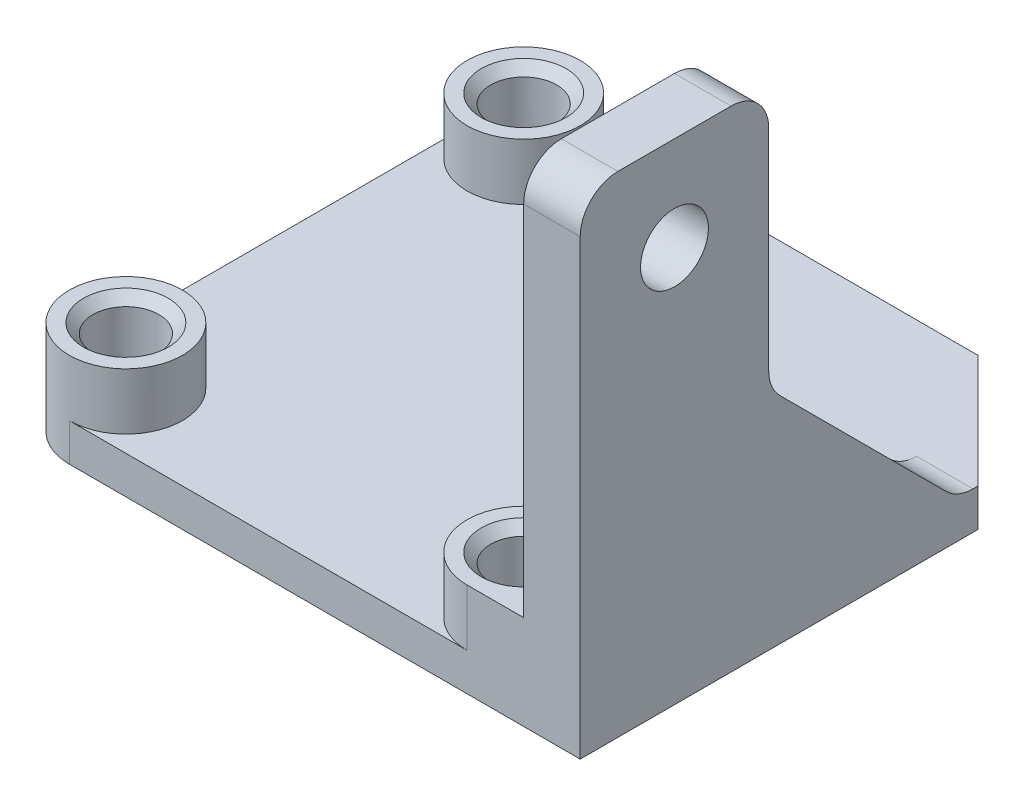
ISO-10303-21;
HEADER;
FILE_DESCRIPTION(('STEP AP214'),'2;1');
FILE_NAME('part.step','',(''),(''),'','','');
FILE_SCHEMA(('AUTOMOTIVE_DESIGN { 1 0 10303 214 1 1 1 1 }'));
ENDSEC;
DATA;
#1=APPLICATION_CONTEXT('core data for automotive mechanical design processes');
#2=APPLICATION_PROTOCOL_DEFINITION('international standard','automotive_design',2000,#1);
#3=PRODUCT_CONTEXT('',#1,'mechanical');
#4=PRODUCT('Part','Part','',(#3));
#5=PRODUCT_RELATED_PRODUCT_CATEGORY('part','',(#4));
#6=PRODUCT_DEFINITION_FORMATION('','',#4);
#7=PRODUCT_DEFINITION_CONTEXT('part definition',#1,'design');
#8=PRODUCT_DEFINITION('design','',#6,#7);
#9=PRODUCT_DEFINITION_SHAPE('','',#8);
#10=(LENGTH_UNIT() NAMED_UNIT(*) SI_UNIT(.MILLI.,.METRE.));
#11=(NAMED_UNIT(*) PLANE_ANGLE_UNIT() SI_UNIT($,.RADIAN.));
#12=(NAMED_UNIT(*) SI_UNIT($,.STERADIAN.) SOLID_ANGLE_UNIT());
#13=UNCERTAINTY_MEASURE_WITH_UNIT(LENGTH_MEASURE(1.E-05),#10,'distance_accuracy_value','');
#14=(GEOMETRIC_REPRESENTATION_CONTEXT(3) GLOBAL_UNCERTAINTY_ASSIGNED_CONTEXT((#13)) GLOBAL_UNIT_ASSIGNED_CONTEXT((#10,
#11,#12)) REPRESENTATION_CONTEXT('',''));
#15=CARTESIAN_POINT('',(0.,0.,0.));
#16=DIRECTION('',(0.,0.,1.));
#17=DIRECTION('',(1.,0.,0.));
#18=AXIS2_PLACEMENT_3D('',#15,#16,#17);
#19=CARTESIAN_POINT('',(0.,0.,0.));
#20=DIRECTION('',(0.,-1.,0.));
#21=DIRECTION('',(0.,0.,-1.));
#22=AXIS2_PLACEMENT_3D('',#19,#20,#21);
#23=PLANE('',#22);
#24=DIRECTION('',(0.,0.,1.));
#25=VECTOR('',#24,1.);
#26=CARTESIAN_POINT('',(6.,0.,-24.1));
#27=LINE('',#26,#25);
#28=CARTESIAN_POINT('',(6.,0.,-18.1));
#29=VERTEX_POINT('',#28);
#30=CARTESIAN_POINT('',(6.,0.,-17.8284271247462));
#31=VERTEX_POINT('',#30);
#32=EDGE_CURVE('E334',#29,#31,#27,.T.);
#33=ORIENTED_EDGE('',*,*,#32,.F.);
#34=DIRECTION('',(0.707106781186546,0.,0.707106781186549));
#35=VECTOR('',#34,1.);
#36=CARTESIAN_POINT('',(0.,0.,-24.1));
#37=LINE('',#36,#35);
#38=CARTESIAN_POINT('',(0.,0.,-24.1));
#39=VERTEX_POINT('',#38);
#40=EDGE_CURVE('E11',#29,#39,#37,.F.);
#41=ORIENTED_EDGE('',*,*,#40,.T.);
#42=DIRECTION('',(1.,0.,0.));
#43=VECTOR('',#42,1.);
#44=CARTESIAN_POINT('',(0.,0.,-24.1));
#45=LINE('',#44,#43);
#46=CARTESIAN_POINT('',(-21.1,0.,-24.1));
#47=VERTEX_POINT('',#46);
#48=EDGE_CURVE('E213',#47,#39,#45,.T.);
#49=ORIENTED_EDGE('',*,*,#48,.F.);
#50=CARTESIAN_POINT('',(-21.1,0.,-21.1));
#51=DIRECTION('',(0.,1.,0.));
#52=DIRECTION('',(0.,0.,1.));
#53=AXIS2_PLACEMENT_3D('',#50,#51,#52);
#54=CIRCLE('',#53,3.);
#55=CARTESIAN_POINT('',(-24.1,0.,-21.1));
#56=VERTEX_POINT('',#55);
#57=EDGE_CURVE('E197',#56,#47,#54,.T.);
#58=ORIENTED_EDGE('',*,*,#57,.F.);
#59=DIRECTION('',(0.,0.,1.));
#60=VECTOR('',#59,1.);
#61=CARTESIAN_POINT('',(-24.1,0.,0.));
#62=LINE('',#61,#60);
#63=CARTESIAN_POINT('',(-24.1,0.,0.));
#64=VERTEX_POINT('',#63);
#65=EDGE_CURVE('E236',#56,#64,#62,.T.);
#66=ORIENTED_EDGE('',*,*,#65,.T.);
#67=CARTESIAN_POINT('',(-21.1,0.,0.));
#68=DIRECTION('',(0.,1.,0.));
#69=DIRECTION('',(0.,0.,1.));
#70=AXIS2_PLACEMENT_3D('',#67,#68,#69);
#71=CIRCLE('',#70,3.);
#72=CARTESIAN_POINT('',(-21.1,0.,3.));
#73=VERTEX_POINT('',#72);
#74=EDGE_CURVE('E201',#73,#64,#71,.T.);
#75=ORIENTED_EDGE('',*,*,#74,.F.);
#76=DIRECTION('',(1.,0.,0.));
#77=VECTOR('',#76,1.);
#78=CARTESIAN_POINT('',(0.,0.,3.));
#79=LINE('',#78,#77);
#80=CARTESIAN_POINT('',(0.,0.,3.));
#81=VERTEX_POINT('',#80);
#82=EDGE_CURVE('E233',#73,#81,#79,.T.);
#83=ORIENTED_EDGE('',*,*,#82,.T.);
#84=CARTESIAN_POINT('',(0.,0.,0.));
#85=DIRECTION('',(0.,1.,0.));
#86=DIRECTION('',(0.,0.,1.));
#87=AXIS2_PLACEMENT_3D('',#84,#85,#86);
#88=CIRCLE('',#87,3.);
#89=CARTESIAN_POINT('',(3.,0.,0.));
#90=VERTEX_POINT('',#89);
#91=EDGE_CURVE('E251',#90,#81,#88,.T.);
#92=ORIENTED_EDGE('',*,*,#91,.F.);
#93=DIRECTION('',(0.,0.,-1.));
#94=VECTOR('',#93,1.);
#95=CARTESIAN_POINT('',(3.,0.,0.));
#96=LINE('',#95,#94);
#97=CARTESIAN_POINT('',(3.,0.,-17.8284271247462));
#98=VERTEX_POINT('',#97);
#99=EDGE_CURVE('E206',#90,#98,#96,.T.);
#100=ORIENTED_EDGE('',*,*,#99,.T.);
#101=DIRECTION('',(-1.,0.,0.));
#102=VECTOR('',#101,1.);
#103=CARTESIAN_POINT('',(6.,0.,-17.8284271247462));
#104=LINE('',#103,#102);
#105=EDGE_CURVE('E303',#98,#31,#104,.F.);
#106=ORIENTED_EDGE('',*,*,#105,.T.);
#107=EDGE_LOOP('',(#33,#41,#49,#58,#66,#75,#83,#92,#100,#106));
#108=FACE_BOUND('',#107,.T.);
#109=ADVANCED_FACE('F37',(#108),#23,.F.);
#110=CARTESIAN_POINT('',(0.,3.,0.));
#111=DIRECTION('',(0.,1.,0.));
#112=DIRECTION('',(0.,0.,1.));
#113=AXIS2_PLACEMENT_3D('',#110,#111,#112);
#114=PLANE('',#113);
#115=CARTESIAN_POINT('',(0.,3.,0.));
#116=DIRECTION('',(0.,1.,0.));
#117=DIRECTION('',(0.,0.,1.));
#118=AXIS2_PLACEMENT_3D('',#115,#116,#117);
#119=CIRCLE('',#118,2.25);
#120=CARTESIAN_POINT('',(0.,3.,2.25));
#121=VERTEX_POINT('',#120);
#122=EDGE_CURVE('E270',#121,#121,#119,.F.);
#123=ORIENTED_EDGE('',*,*,#122,.T.);
#124=EDGE_LOOP('',(#123));
#125=FACE_BOUND('',#124,.T.);
#126=CARTESIAN_POINT('',(0.,3.,0.));
#127=DIRECTION('',(0.,1.,0.));
#128=DIRECTION('',(0.,0.,1.));
#129=AXIS2_PLACEMENT_3D('',#126,#127,#128);
#130=CIRCLE('',#129,3.);
#131=CARTESIAN_POINT('',(3.00000000000001,3.,0.));
#132=VERTEX_POINT('',#131);
#133=CARTESIAN_POINT('',(0.,3.,3.));
#134=VERTEX_POINT('',#133);
#135=EDGE_CURVE('E170',#132,#134,#130,.T.);
#136=ORIENTED_EDGE('',*,*,#135,.T.);
#137=DIRECTION('',(-1.,0.,0.));
#138=VECTOR('',#137,1.);
#139=CARTESIAN_POINT('',(0.,3.,3.));
#140=LINE('',#139,#138);
#141=CARTESIAN_POINT('',(3.00000000000001,3.,3.));
#142=VERTEX_POINT('',#141);
#143=EDGE_CURVE('E166',#142,#134,#140,.T.);
#144=ORIENTED_EDGE('',*,*,#143,.F.);
#145=DIRECTION('',(0.,0.,1.));
#146=VECTOR('',#145,1.);
#147=CARTESIAN_POINT('',(3.,3.,-24.1));
#148=LINE('',#147,#146);
#149=EDGE_CURVE('E156',#132,#142,#148,.T.);
#150=ORIENTED_EDGE('',*,*,#149,.F.);
#151=EDGE_LOOP('',(#136,#144,#150));
#152=FACE_BOUND('',#151,.T.);
#153=ADVANCED_FACE('F169',(#125,#152),#114,.T.);
#154=CARTESIAN_POINT('',(0.,3.,0.));
#155=DIRECTION('',(0.,-1.,0.));
#156=DIRECTION('',(0.,0.,-1.));
#157=AXIS2_PLACEMENT_3D('',#154,#155,#156);
#158=CYLINDRICAL_SURFACE('',#157,3.);
#159=ORIENTED_EDGE('',*,*,#135,.F.);
#160=DIRECTION('',(0.,-1.,0.));
#161=VECTOR('',#160,1.);
#162=CARTESIAN_POINT('',(3.,24.,0.));
#163=LINE('',#162,#161);
#164=EDGE_CURVE('E163',#132,#90,#163,.T.);
#165=ORIENTED_EDGE('',*,*,#164,.T.);
#166=ORIENTED_EDGE('',*,*,#91,.T.);
#167=DIRECTION('',(0.,-1.,0.));
#168=VECTOR('',#167,1.);
#169=CARTESIAN_POINT('',(0.,24.,3.));
#170=LINE('',#169,#168);
#171=EDGE_CURVE('E194',#134,#81,#170,.T.);
#172=ORIENTED_EDGE('',*,*,#171,.F.);
#173=EDGE_LOOP('',(#159,#165,#166,#172));
#174=FACE_BOUND('',#173,.T.);
#175=ADVANCED_FACE('F348',(#174),#158,.T.);
#176=CARTESIAN_POINT('',(0.,3.,0.));
#177=DIRECTION('',(0.,-1.,0.));
#178=DIRECTION('',(0.,0.,-1.));
#179=AXIS2_PLACEMENT_3D('',#176,#177,#178);
#180=CYLINDRICAL_SURFACE('',#179,1.75);
#181=CARTESIAN_POINT('',(0.,2.5,0.));
#182=DIRECTION('',(0.,1.,0.));
#183=DIRECTION('',(0.,0.,1.));
#184=AXIS2_PLACEMENT_3D('',#181,#182,#183);
#185=CIRCLE('',#184,1.75);
#186=CARTESIAN_POINT('',(0.,2.5,1.75));
#187=VERTEX_POINT('',#186);
#188=EDGE_CURVE('E267',#187,#187,#185,.T.);
#189=ORIENTED_EDGE('',*,*,#188,.T.);
#190=EDGE_LOOP('',(#189));
#191=FACE_BOUND('',#190,.T.);
#192=CARTESIAN_POINT('',(0.,-2.,0.));
#193=DIRECTION('',(0.,-1.,0.));
#194=DIRECTION('',(0.,0.,-1.));
#195=AXIS2_PLACEMENT_3D('',#192,#193,#194);
#196=CIRCLE('',#195,1.75);
#197=CARTESIAN_POINT('',(0.,-2.,-1.75));
#198=VERTEX_POINT('',#197);
#199=EDGE_CURVE('E228',#198,#198,#196,.T.);
#200=ORIENTED_EDGE('',*,*,#199,.T.);
#201=EDGE_LOOP('',(#200));
#202=FACE_BOUND('',#201,.T.);
#203=ADVANCED_FACE('F376',(#191,#202),#180,.F.);
#204=CARTESIAN_POINT('',(0.,-2.,3.));
#205=DIRECTION('',(0.,0.,1.));
#206=DIRECTION('',(1.,0.,0.));
#207=AXIS2_PLACEMENT_3D('',#204,#205,#206);
#208=PLANE('',#207);
#209=DIRECTION('',(0.,-1.,0.));
#210=VECTOR('',#209,1.);
#211=CARTESIAN_POINT('',(6.,24.,3.));
#212=LINE('',#211,#210);
#213=CARTESIAN_POINT('',(6.,22.,3.));
#214=VERTEX_POINT('',#213);
#215=CARTESIAN_POINT('',(6.,-2.,3.));
#216=VERTEX_POINT('',#215);
#217=EDGE_CURVE('E192',#214,#216,#212,.T.);
#218=ORIENTED_EDGE('',*,*,#217,.F.);
#219=DIRECTION('',(1.,0.,0.));
#220=VECTOR('',#219,1.);
#221=CARTESIAN_POINT('',(0.,22.,3.));
#222=LINE('',#221,#220);
#223=CARTESIAN_POINT('',(3.00000000000001,22.,3.));
#224=VERTEX_POINT('',#223);
#225=EDGE_CURVE('E178',#214,#224,#222,.F.);
#226=ORIENTED_EDGE('',*,*,#225,.T.);
#227=DIRECTION('',(0.,1.,0.));
#228=VECTOR('',#227,1.);
#229=CARTESIAN_POINT('',(3.00000000000001,-24.2655460242409,3.));
#230=LINE('',#229,#228);
#231=EDGE_CURVE('E160',#142,#224,#230,.T.);
#232=ORIENTED_EDGE('',*,*,#231,.F.);
#233=ORIENTED_EDGE('',*,*,#143,.T.);
#234=ORIENTED_EDGE('',*,*,#171,.T.);
#235=ORIENTED_EDGE('',*,*,#82,.F.);
#236=DIRECTION('',(0.,1.,0.));
#237=VECTOR('',#236,1.);
#238=CARTESIAN_POINT('',(-21.1,-2.,3.));
#239=LINE('',#238,#237);
#240=CARTESIAN_POINT('',(-21.1,-2.,3.));
#241=VERTEX_POINT('',#240);
#242=EDGE_CURVE('E248',#241,#73,#239,.T.);
#243=ORIENTED_EDGE('',*,*,#242,.F.);
#244=DIRECTION('',(1.,0.,0.));
#245=VECTOR('',#244,1.);
#246=CARTESIAN_POINT('',(0.,-2.,3.));
#247=LINE('',#246,#245);
#248=EDGE_CURVE('E209',#241,#216,#247,.T.);
#249=ORIENTED_EDGE('',*,*,#248,.T.);
#250=EDGE_LOOP('',(#218,#226,#232,#233,#234,#235,#243,#249));
#251=FACE_BOUND('',#250,.T.);
#252=ADVANCED_FACE('F176',(#251),#208,.T.);
#253=CARTESIAN_POINT('',(-21.1,-2.,0.));
#254=DIRECTION('',(0.,1.,0.));
#255=DIRECTION('',(0.,0.,1.));
#256=AXIS2_PLACEMENT_3D('',#253,#254,#255);
#257=CYLINDRICAL_SURFACE('',#256,3.);
#258=ORIENTED_EDGE('',*,*,#242,.T.);
#259=ORIENTED_EDGE('',*,*,#74,.T.);
#260=DIRECTION('',(0.,1.,0.));
#261=VECTOR('',#260,1.);
#262=CARTESIAN_POINT('',(-24.1,-2.,0.));
#263=LINE('',#262,#261);
#264=CARTESIAN_POINT('',(-24.1,-2.,0.));
#265=VERTEX_POINT('',#264);
#266=EDGE_CURVE('E245',#265,#64,#263,.T.);
#267=ORIENTED_EDGE('',*,*,#266,.F.);
#268=CARTESIAN_POINT('',(-21.1,-2.,0.));
#269=DIRECTION('',(0.,-1.,0.));
#270=DIRECTION('',(0.,0.,-1.));
#271=AXIS2_PLACEMENT_3D('',#268,#269,#270);
#272=CIRCLE('',#271,3.);
#273=EDGE_CURVE('E212',#241,#265,#272,.T.);
#274=ORIENTED_EDGE('',*,*,#273,.F.);
#275=EDGE_LOOP('',(#258,#259,#267,#274));
#276=FACE_BOUND('',#275,.T.);
#277=CARTESIAN_POINT('',(-21.1,3.,0.));
#278=DIRECTION('',(0.,1.,0.));
#279=DIRECTION('',(0.,0.,1.));
#280=AXIS2_PLACEMENT_3D('',#277,#278,#279);
#281=CIRCLE('',#280,3.);
#282=CARTESIAN_POINT('',(-21.1,3.,3.));
#283=VERTEX_POINT('',#282);
#284=EDGE_CURVE('E203',#283,#283,#281,.T.);
#285=ORIENTED_EDGE('',*,*,#284,.F.);
#286=EDGE_LOOP('',(#285));
#287=FACE_BOUND('',#286,.T.);
#288=ADVANCED_FACE('F369',(#276,#287),#257,.T.);
#289=CARTESIAN_POINT('',(-24.1,-2.,0.));
#290=DIRECTION('',(-1.,0.,0.));
#291=DIRECTION('',(0.,0.,1.));
#292=AXIS2_PLACEMENT_3D('',#289,#290,#291);
#293=PLANE('',#292);
#294=ORIENTED_EDGE('',*,*,#65,.F.);
#295=DIRECTION('',(0.,1.,0.));
#296=VECTOR('',#295,1.);
#297=CARTESIAN_POINT('',(-24.1,-2.,-21.1));
#298=LINE('',#297,#296);
#299=CARTESIAN_POINT('',(-24.1,-2.,-21.1));
#300=VERTEX_POINT('',#299);
#301=EDGE_CURVE('E242',#300,#56,#298,.T.);
#302=ORIENTED_EDGE('',*,*,#301,.F.);
#303=DIRECTION('',(0.,0.,1.));
#304=VECTOR('',#303,1.);
#305=CARTESIAN_POINT('',(-24.1,-2.,0.));
#306=LINE('',#305,#304);
#307=EDGE_CURVE('E215',#300,#265,#306,.T.);
#308=ORIENTED_EDGE('',*,*,#307,.T.);
#309=ORIENTED_EDGE('',*,*,#266,.T.);
#310=EDGE_LOOP('',(#294,#302,#308,#309));
#311=FACE_BOUND('',#310,.T.);
#312=ADVANCED_FACE('F366',(#311),#293,.T.);
#313=CARTESIAN_POINT('',(-21.1,-2.,-21.1));
#314=DIRECTION('',(0.,1.,0.));
#315=DIRECTION('',(0.,0.,1.));
#316=AXIS2_PLACEMENT_3D('',#313,#314,#315);
#317=CYLINDRICAL_SURFACE('',#316,3.);
#318=ORIENTED_EDGE('',*,*,#301,.T.);
#319=ORIENTED_EDGE('',*,*,#57,.T.);
#320=DIRECTION('',(0.,1.,0.));
#321=VECTOR('',#320,1.);
#322=CARTESIAN_POINT('',(-21.1,-2.,-24.1));
#323=LINE('',#322,#321);
#324=CARTESIAN_POINT('',(-21.1,-2.,-24.1));
#325=VERTEX_POINT('',#324);
#326=EDGE_CURVE('E231',#325,#47,#323,.T.);
#327=ORIENTED_EDGE('',*,*,#326,.F.);
#328=CARTESIAN_POINT('',(-21.1,-2.,-21.1));
#329=DIRECTION('',(0.,-1.,0.));
#330=DIRECTION('',(0.,0.,-1.));
#331=AXIS2_PLACEMENT_3D('',#328,#329,#330);
#332=CIRCLE('',#331,3.);
#333=EDGE_CURVE('E218',#300,#325,#332,.T.);
#334=ORIENTED_EDGE('',*,*,#333,.F.);
#335=EDGE_LOOP('',(#318,#319,#327,#334));
#336=FACE_BOUND('',#335,.T.);
#337=CARTESIAN_POINT('',(-21.1,3.,-21.1));
#338=DIRECTION('',(0.,1.,0.));
#339=DIRECTION('',(0.,0.,1.));
#340=AXIS2_PLACEMENT_3D('',#337,#338,#339);
#341=CIRCLE('',#340,3.);
#342=CARTESIAN_POINT('',(-21.1,3.,-18.1));
#343=VERTEX_POINT('',#342);
#344=EDGE_CURVE('E198',#343,#343,#341,.T.);
#345=ORIENTED_EDGE('',*,*,#344,.F.);
#346=EDGE_LOOP('',(#345));
#347=FACE_BOUND('',#346,.T.);
#348=ADVANCED_FACE('F331',(#336,#347),#317,.T.);
#349=CARTESIAN_POINT('',(-21.1,-2.,0.));
#350=DIRECTION('',(0.,1.,0.));
#351=DIRECTION('',(0.,0.,1.));
#352=AXIS2_PLACEMENT_3D('',#349,#350,#351);
#353=CYLINDRICAL_SURFACE('',#352,1.75);
#354=CARTESIAN_POINT('',(-21.1,2.5,0.));
#355=DIRECTION('',(0.,1.,0.));
#356=DIRECTION('',(0.,0.,1.));
#357=AXIS2_PLACEMENT_3D('',#354,#355,#356);
#358=CIRCLE('',#357,1.75);
#359=CARTESIAN_POINT('',(-21.1,2.5,1.75));
#360=VERTEX_POINT('',#359);
#361=EDGE_CURVE('E261',#360,#360,#358,.T.);
#362=ORIENTED_EDGE('',*,*,#361,.T.);
#363=EDGE_LOOP('',(#362));
#364=FACE_BOUND('',#363,.T.);
#365=CARTESIAN_POINT('',(-21.1,-2.,0.));
#366=DIRECTION('',(0.,-1.,0.));
#367=DIRECTION('',(0.,0.,-1.));
#368=AXIS2_PLACEMENT_3D('',#365,#366,#367);
#369=CIRCLE('',#368,1.75);
#370=CARTESIAN_POINT('',(-21.1,-2.,-1.75));
#371=VERTEX_POINT('',#370);
#372=EDGE_CURVE('E225',#371,#371,#369,.F.);
#373=ORIENTED_EDGE('',*,*,#372,.F.);
#374=EDGE_LOOP('',(#373));
#375=FACE_BOUND('',#374,.T.);
#376=ADVANCED_FACE('F354',(#364,#375),#353,.F.);
#377=CARTESIAN_POINT('',(-21.1,-2.,-21.1));
#378=DIRECTION('',(0.,1.,0.));
#379=DIRECTION('',(0.,0.,1.));
#380=AXIS2_PLACEMENT_3D('',#377,#378,#379);
#381=CYLINDRICAL_SURFACE('',#380,1.75);
#382=CARTESIAN_POINT('',(-21.1,2.5,-21.1));
#383=DIRECTION('',(0.,1.,0.));
#384=DIRECTION('',(0.,0.,1.));
#385=AXIS2_PLACEMENT_3D('',#382,#383,#384);
#386=CIRCLE('',#385,1.75);
#387=CARTESIAN_POINT('',(-21.1,2.5,-19.35));
#388=VERTEX_POINT('',#387);
#389=EDGE_CURVE('E253',#388,#388,#386,.T.);
#390=ORIENTED_EDGE('',*,*,#389,.T.);
#391=EDGE_LOOP('',(#390));
#392=FACE_BOUND('',#391,.T.);
#393=CARTESIAN_POINT('',(-21.1,-2.,-21.1));
#394=DIRECTION('',(0.,-1.,0.));
#395=DIRECTION('',(0.,0.,-1.));
#396=AXIS2_PLACEMENT_3D('',#393,#394,#395);
#397=CIRCLE('',#396,1.75);
#398=CARTESIAN_POINT('',(-21.1,-2.,-22.85));
#399=VERTEX_POINT('',#398);
#400=EDGE_CURVE('E222',#399,#399,#397,.T.);
#401=ORIENTED_EDGE('',*,*,#400,.T.);
#402=EDGE_LOOP('',(#401));
#403=FACE_BOUND('',#402,.T.);
#404=ADVANCED_FACE('F357',(#392,#403),#381,.F.);
#405=CARTESIAN_POINT('',(0.,-2.,-24.1));
#406=DIRECTION('',(0.,0.,1.));
#407=DIRECTION('',(1.,0.,0.));
#408=AXIS2_PLACEMENT_3D('',#405,#406,#407);
#409=PLANE('',#408);
#410=ORIENTED_EDGE('',*,*,#48,.T.);
#411=DIRECTION('',(0.,-1.,0.));
#412=VECTOR('',#411,1.);
#413=CARTESIAN_POINT('',(0.,-2.,-24.1));
#414=LINE('',#413,#412);
#415=CARTESIAN_POINT('',(0.,-2.,-24.1));
#416=VERTEX_POINT('',#415);
#417=EDGE_CURVE('E315',#39,#416,#414,.T.);
#418=ORIENTED_EDGE('',*,*,#417,.T.);
#419=DIRECTION('',(1.,0.,0.));
#420=VECTOR('',#419,1.);
#421=CARTESIAN_POINT('',(0.,-2.,-24.1));
#422=LINE('',#421,#420);
#423=EDGE_CURVE('E220',#325,#416,#422,.T.);
#424=ORIENTED_EDGE('',*,*,#423,.F.);
#425=ORIENTED_EDGE('',*,*,#326,.T.);
#426=EDGE_LOOP('',(#410,#418,#424,#425));
#427=FACE_BOUND('',#426,.T.);
#428=ADVANCED_FACE('F321',(#427),#409,.F.);
#429=CARTESIAN_POINT('',(0.,-2.,0.));
#430=DIRECTION('',(0.,-1.,0.));
#431=DIRECTION('',(0.,0.,-1.));
#432=AXIS2_PLACEMENT_3D('',#429,#430,#431);
#433=PLANE('',#432);
#434=ORIENTED_EDGE('',*,*,#423,.T.);
#435=DIRECTION('',(-0.707106781186546,0.,-0.707106781186549));
#436=VECTOR('',#435,1.);
#437=CARTESIAN_POINT('',(12.05,-2.,-12.0499999999999));
#438=LINE('',#437,#436);
#439=CARTESIAN_POINT('',(5.99999999999999,-2.,-18.1));
#440=VERTEX_POINT('',#439);
#441=EDGE_CURVE('E60',#416,#440,#438,.F.);
#442=ORIENTED_EDGE('',*,*,#441,.T.);
#443=DIRECTION('',(0.,0.,-1.));
#444=VECTOR('',#443,1.);
#445=CARTESIAN_POINT('',(5.99999999999999,-2.,-24.1));
#446=LINE('',#445,#444);
#447=EDGE_CURVE('E173',#216,#440,#446,.T.);
#448=ORIENTED_EDGE('',*,*,#447,.F.);
#449=ORIENTED_EDGE('',*,*,#248,.F.);
#450=ORIENTED_EDGE('',*,*,#273,.T.);
#451=ORIENTED_EDGE('',*,*,#307,.F.);
#452=ORIENTED_EDGE('',*,*,#333,.T.);
#453=EDGE_LOOP('',(#434,#442,#448,#449,#450,#451,#452));
#454=FACE_BOUND('',#453,.T.);
#455=ORIENTED_EDGE('',*,*,#400,.F.);
#456=EDGE_LOOP('',(#455));
#457=FACE_BOUND('',#456,.T.);
#458=ORIENTED_EDGE('',*,*,#372,.T.);
#459=EDGE_LOOP('',(#458));
#460=FACE_BOUND('',#459,.T.);
#461=ORIENTED_EDGE('',*,*,#199,.F.);
#462=EDGE_LOOP('',(#461));
#463=FACE_BOUND('',#462,.T.);
#464=ADVANCED_FACE('F325',(#454,#457,#460,#463),#433,.T.);
#465=CARTESIAN_POINT('',(-21.1,3.,0.));
#466=DIRECTION('',(0.,1.,0.));
#467=DIRECTION('',(0.,0.,1.));
#468=AXIS2_PLACEMENT_3D('',#465,#466,#467);
#469=PLANE('',#468);
#470=CARTESIAN_POINT('',(-21.1,3.,0.));
#471=DIRECTION('',(0.,1.,0.));
#472=DIRECTION('',(0.,0.,1.));
#473=AXIS2_PLACEMENT_3D('',#470,#471,#472);
#474=CIRCLE('',#473,2.25000000000001);
#475=CARTESIAN_POINT('',(-21.1,3.,2.25000000000001));
#476=VERTEX_POINT('',#475);
#477=EDGE_CURVE('E264',#476,#476,#474,.F.);
#478=ORIENTED_EDGE('',*,*,#477,.T.);
#479=EDGE_LOOP('',(#478));
#480=FACE_BOUND('',#479,.T.);
#481=ORIENTED_EDGE('',*,*,#284,.T.);
#482=EDGE_LOOP('',(#481));
#483=FACE_BOUND('',#482,.T.);
#484=ADVANCED_FACE('F461',(#480,#483),#469,.T.);
#485=CARTESIAN_POINT('',(-21.1,3.,-21.1));
#486=DIRECTION('',(0.,1.,0.));
#487=DIRECTION('',(0.,0.,1.));
#488=AXIS2_PLACEMENT_3D('',#485,#486,#487);
#489=PLANE('',#488);
#490=CARTESIAN_POINT('',(-21.1,3.,-21.1));
#491=DIRECTION('',(0.,1.,0.));
#492=DIRECTION('',(0.,0.,1.));
#493=AXIS2_PLACEMENT_3D('',#490,#491,#492);
#494=CIRCLE('',#493,2.25000000000001);
#495=CARTESIAN_POINT('',(-21.1,3.,-18.85));
#496=VERTEX_POINT('',#495);
#497=EDGE_CURVE('E258',#496,#496,#494,.F.);
#498=ORIENTED_EDGE('',*,*,#497,.T.);
#499=EDGE_LOOP('',(#498));
#500=FACE_BOUND('',#499,.T.);
#501=ORIENTED_EDGE('',*,*,#344,.T.);
#502=EDGE_LOOP('',(#501));
#503=FACE_BOUND('',#502,.T.);
#504=ADVANCED_FACE('F391',(#500,#503),#489,.T.);
#505=CARTESIAN_POINT('',(-21.1,2.5,-21.1));
#506=DIRECTION('',(0.,1.,0.));
#507=DIRECTION('',(0.,0.,1.));
#508=AXIS2_PLACEMENT_3D('',#505,#506,#507);
#509=CONICAL_SURFACE('',#508,1.75,0.785398163397453);
#510=ORIENTED_EDGE('',*,*,#497,.F.);
#511=EDGE_LOOP('',(#510));
#512=FACE_BOUND('',#511,.T.);
#513=ORIENTED_EDGE('',*,*,#389,.F.);
#514=EDGE_LOOP('',(#513));
#515=FACE_BOUND('',#514,.T.);
#516=ADVANCED_FACE('F384',(#512,#515),#509,.F.);
#517=CARTESIAN_POINT('',(-21.1,2.5,0.));
#518=DIRECTION('',(0.,1.,0.));
#519=DIRECTION('',(0.,0.,1.));
#520=AXIS2_PLACEMENT_3D('',#517,#518,#519);
#521=CONICAL_SURFACE('',#520,1.75,0.785398163397452);
#522=ORIENTED_EDGE('',*,*,#477,.F.);
#523=EDGE_LOOP('',(#522));
#524=FACE_BOUND('',#523,.T.);
#525=ORIENTED_EDGE('',*,*,#361,.F.);
#526=EDGE_LOOP('',(#525));
#527=FACE_BOUND('',#526,.T.);
#528=ADVANCED_FACE('F390',(#524,#527),#521,.F.);
#529=CARTESIAN_POINT('',(0.,2.5,0.));
#530=DIRECTION('',(0.,1.,0.));
#531=DIRECTION('',(0.,0.,1.));
#532=AXIS2_PLACEMENT_3D('',#529,#530,#531);
#533=CONICAL_SURFACE('',#532,1.75,0.785398163397452);
#534=ORIENTED_EDGE('',*,*,#122,.F.);
#535=EDGE_LOOP('',(#534));
#536=FACE_BOUND('',#535,.T.);
#537=ORIENTED_EDGE('',*,*,#188,.F.);
#538=EDGE_LOOP('',(#537));
#539=FACE_BOUND('',#538,.T.);
#540=ADVANCED_FACE('F398',(#536,#539),#533,.F.);
#541=CARTESIAN_POINT('',(3.,24.,0.));
#542=DIRECTION('',(1.,0.,0.));
#543=DIRECTION('',(0.,0.,-1.));
#544=AXIS2_PLACEMENT_3D('',#541,#542,#543);
#545=PLANE('',#544);
#546=CARTESIAN_POINT('',(3.,19.,-2.));
#547=DIRECTION('',(-1.,0.,0.));
#548=DIRECTION('',(0.,0.,1.));
#549=AXIS2_PLACEMENT_3D('',#546,#547,#548);
#550=CIRCLE('',#549,1.8);
#551=CARTESIAN_POINT('',(3.,19.,-0.200000000000002));
#552=VERTEX_POINT('',#551);
#553=EDGE_CURVE('E182',#552,#552,#550,.T.);
#554=ORIENTED_EDGE('',*,*,#553,.F.);
#555=EDGE_LOOP('',(#554));
#556=FACE_BOUND('',#555,.T.);
#557=ORIENTED_EDGE('',*,*,#231,.T.);
#558=CARTESIAN_POINT('',(3.,22.,1.));
#559=DIRECTION('',(1.,0.,0.));
#560=DIRECTION('',(0.,0.,-1.));
#561=AXIS2_PLACEMENT_3D('',#558,#559,#560);
#562=CIRCLE('',#561,2.);
#563=CARTESIAN_POINT('',(3.,24.,1.));
#564=VERTEX_POINT('',#563);
#565=EDGE_CURVE('E292',#224,#564,#562,.F.);
#566=ORIENTED_EDGE('',*,*,#565,.T.);
#567=DIRECTION('',(0.,0.,1.));
#568=VECTOR('',#567,1.);
#569=CARTESIAN_POINT('',(3.,24.,0.));
#570=LINE('',#569,#568);
#571=CARTESIAN_POINT('',(3.,24.,-5.));
#572=VERTEX_POINT('',#571);
#573=EDGE_CURVE('E186',#572,#564,#570,.T.);
#574=ORIENTED_EDGE('',*,*,#573,.F.);
#575=CARTESIAN_POINT('',(3.,22.,-5.));
#576=DIRECTION('',(1.,0.,0.));
#577=DIRECTION('',(0.,0.,-1.));
#578=AXIS2_PLACEMENT_3D('',#575,#576,#577);
#579=CIRCLE('',#578,2.);
#580=CARTESIAN_POINT('',(3.,22.,-7.));
#581=VERTEX_POINT('',#580);
#582=EDGE_CURVE('E290',#572,#581,#579,.F.);
#583=ORIENTED_EDGE('',*,*,#582,.T.);
#584=DIRECTION('',(0.,-1.,0.));
#585=VECTOR('',#584,1.);
#586=CARTESIAN_POINT('',(3.,24.,-7.));
#587=LINE('',#586,#585);
#588=CARTESIAN_POINT('',(3.,10.8284271247463,-7.));
#589=VERTEX_POINT('',#588);
#590=EDGE_CURVE('E438',#581,#589,#587,.T.);
#591=ORIENTED_EDGE('',*,*,#590,.T.);
#592=CARTESIAN_POINT('',(3.,10.8284271247463,-9.));
#593=DIRECTION('',(1.,0.,0.));
#594=DIRECTION('',(0.,0.,-1.));
#595=AXIS2_PLACEMENT_3D('',#592,#593,#594);
#596=CIRCLE('',#595,2.);
#597=CARTESIAN_POINT('',(3.,9.41421356237316,-7.58578643762689));
#598=VERTEX_POINT('',#597);
#599=EDGE_CURVE('E306',#589,#598,#596,.T.);
#600=ORIENTED_EDGE('',*,*,#599,.T.);
#601=DIRECTION('',(0.,0.707106781186551,0.707106781186544));
#602=VECTOR('',#601,1.);
#603=CARTESIAN_POINT('',(3.,20.5000000000001,3.49999999999993));
#604=LINE('',#603,#602);
#605=CARTESIAN_POINT('',(3.,0.585786437626912,-16.414213562373));
#606=VERTEX_POINT('',#605);
#607=EDGE_CURVE('E273',#598,#606,#604,.F.);
#608=ORIENTED_EDGE('',*,*,#607,.T.);
#609=CARTESIAN_POINT('',(3.,2.,-17.8284271247462));
#610=DIRECTION('',(1.,0.,0.));
#611=DIRECTION('',(0.,0.,-1.));
#612=AXIS2_PLACEMENT_3D('',#609,#610,#611);
#613=CIRCLE('',#612,2.);
#614=EDGE_CURVE('E312',#606,#98,#613,.T.);
#615=ORIENTED_EDGE('',*,*,#614,.T.);
#616=ORIENTED_EDGE('',*,*,#99,.F.);
#617=ORIENTED_EDGE('',*,*,#164,.F.);
#618=ORIENTED_EDGE('',*,*,#149,.T.);
#619=EDGE_LOOP('',(#557,#566,#574,#583,#591,#600,#608,#615,#616,#617,#618));
#620=FACE_BOUND('',#619,.T.);
#621=ADVANCED_FACE('F158',(#556,#620),#545,.F.);
#622=CARTESIAN_POINT('',(5.99999999999999,24.,-24.1));
#623=DIRECTION('',(-1.,0.,0.));
#624=DIRECTION('',(0.,0.,1.));
#625=AXIS2_PLACEMENT_3D('',#622,#623,#624);
#626=PLANE('',#625);
#627=CARTESIAN_POINT('',(6.,19.,-2.));
#628=DIRECTION('',(-1.,0.,0.));
#629=DIRECTION('',(0.,0.,1.));
#630=AXIS2_PLACEMENT_3D('',#627,#628,#629);
#631=CIRCLE('',#630,1.8);
#632=CARTESIAN_POINT('',(6.,19.,-0.200000000000001));
#633=VERTEX_POINT('',#632);
#634=EDGE_CURVE('E179',#633,#633,#631,.T.);
#635=ORIENTED_EDGE('',*,*,#634,.T.);
#636=EDGE_LOOP('',(#635));
#637=FACE_BOUND('',#636,.T.);
#638=ORIENTED_EDGE('',*,*,#447,.T.);
#639=DIRECTION('',(0.,1.,0.));
#640=VECTOR('',#639,1.);
#641=CARTESIAN_POINT('',(5.99999999999999,24.,-18.1));
#642=LINE('',#641,#640);
#643=EDGE_CURVE('E46',#440,#29,#642,.T.);
#644=ORIENTED_EDGE('',*,*,#643,.T.);
#645=ORIENTED_EDGE('',*,*,#32,.T.);
#646=CARTESIAN_POINT('',(5.99999999999999,2.,-17.8284271247462));
#647=DIRECTION('',(-1.,0.,0.));
#648=DIRECTION('',(0.,0.,1.));
#649=AXIS2_PLACEMENT_3D('',#646,#647,#648);
#650=CIRCLE('',#649,2.);
#651=CARTESIAN_POINT('',(5.99999999999999,0.585786437626914,-16.4142135623731));
#652=VERTEX_POINT('',#651);
#653=EDGE_CURVE('E310',#31,#652,#650,.T.);
#654=ORIENTED_EDGE('',*,*,#653,.T.);
#655=DIRECTION('',(0.,-0.707106781186551,-0.707106781186544));
#656=VECTOR('',#655,1.);
#657=CARTESIAN_POINT('',(5.99999999999999,8.45000000000011,-8.54999999999994));
#658=LINE('',#657,#656);
#659=CARTESIAN_POINT('',(5.99999999999999,9.41421356237317,-7.58578643762689));
#660=VERTEX_POINT('',#659);
#661=EDGE_CURVE('E276',#652,#660,#658,.F.);
#662=ORIENTED_EDGE('',*,*,#661,.T.);
#663=CARTESIAN_POINT('',(5.99999999999999,10.8284271247463,-9.));
#664=DIRECTION('',(-1.,0.,0.));
#665=DIRECTION('',(0.,0.,1.));
#666=AXIS2_PLACEMENT_3D('',#663,#664,#665);
#667=CIRCLE('',#666,2.);
#668=CARTESIAN_POINT('',(6.,10.8284271247463,-7.));
#669=VERTEX_POINT('',#668);
#670=EDGE_CURVE('E308',#660,#669,#667,.T.);
#671=ORIENTED_EDGE('',*,*,#670,.T.);
#672=DIRECTION('',(0.,1.,0.));
#673=VECTOR('',#672,1.);
#674=CARTESIAN_POINT('',(6.,24.,-7.));
#675=LINE('',#674,#673);
#676=CARTESIAN_POINT('',(6.,22.,-7.));
#677=VERTEX_POINT('',#676);
#678=EDGE_CURVE('E431',#669,#677,#675,.T.);
#679=ORIENTED_EDGE('',*,*,#678,.T.);
#680=CARTESIAN_POINT('',(6.,22.,-5.));
#681=DIRECTION('',(-1.,0.,0.));
#682=DIRECTION('',(0.,0.,1.));
#683=AXIS2_PLACEMENT_3D('',#680,#681,#682);
#684=CIRCLE('',#683,2.);
#685=CARTESIAN_POINT('',(6.,24.,-5.));
#686=VERTEX_POINT('',#685);
#687=EDGE_CURVE('E285',#677,#686,#684,.F.);
#688=ORIENTED_EDGE('',*,*,#687,.T.);
#689=DIRECTION('',(0.,0.,-1.));
#690=VECTOR('',#689,1.);
#691=CARTESIAN_POINT('',(5.99999999999999,24.,-24.1));
#692=LINE('',#691,#690);
#693=CARTESIAN_POINT('',(6.,24.,1.));
#694=VERTEX_POINT('',#693);
#695=EDGE_CURVE('E189',#694,#686,#692,.T.);
#696=ORIENTED_EDGE('',*,*,#695,.F.);
#697=CARTESIAN_POINT('',(6.,22.,1.));
#698=DIRECTION('',(-1.,0.,0.));
#699=DIRECTION('',(0.,0.,1.));
#700=AXIS2_PLACEMENT_3D('',#697,#698,#699);
#701=CIRCLE('',#700,2.);
#702=EDGE_CURVE('E287',#694,#214,#701,.F.);
#703=ORIENTED_EDGE('',*,*,#702,.T.);
#704=ORIENTED_EDGE('',*,*,#217,.T.);
#705=EDGE_LOOP('',(#638,#644,#645,#654,#662,#671,#679,#688,#696,#703,#704));
#706=FACE_BOUND('',#705,.T.);
#707=ADVANCED_FACE('F430',(#637,#706),#626,.F.);
#708=CARTESIAN_POINT('',(0.,24.,-21.1));
#709=DIRECTION('',(0.,1.,0.));
#710=DIRECTION('',(0.,0.,1.));
#711=AXIS2_PLACEMENT_3D('',#708,#709,#710);
#712=PLANE('',#711);
#713=ORIENTED_EDGE('',*,*,#573,.T.);
#714=DIRECTION('',(1.,0.,0.));
#715=VECTOR('',#714,1.);
#716=CARTESIAN_POINT('',(0.,24.,1.));
#717=LINE('',#716,#715);
#718=EDGE_CURVE('E282',#564,#694,#717,.T.);
#719=ORIENTED_EDGE('',*,*,#718,.T.);
#720=ORIENTED_EDGE('',*,*,#695,.T.);
#721=DIRECTION('',(-1.,0.,0.));
#722=VECTOR('',#721,1.);
#723=CARTESIAN_POINT('',(3.,24.,-5.));
#724=LINE('',#723,#722);
#725=EDGE_CURVE('E279',#686,#572,#724,.T.);
#726=ORIENTED_EDGE('',*,*,#725,.T.);
#727=EDGE_LOOP('',(#713,#719,#720,#726));
#728=FACE_BOUND('',#727,.T.);
#729=ADVANCED_FACE('F455',(#728),#712,.T.);
#730=CARTESIAN_POINT('',(3.,19.,-2.));
#731=DIRECTION('',(-1.,0.,0.));
#732=DIRECTION('',(0.,0.,1.));
#733=AXIS2_PLACEMENT_3D('',#730,#731,#732);
#734=CYLINDRICAL_SURFACE('',#733,1.8);
#735=ORIENTED_EDGE('',*,*,#553,.T.);
#736=EDGE_LOOP('',(#735));
#737=FACE_BOUND('',#736,.T.);
#738=ORIENTED_EDGE('',*,*,#634,.F.);
#739=EDGE_LOOP('',(#738));
#740=FACE_BOUND('',#739,.T.);
#741=ADVANCED_FACE('F446',(#737,#740),#734,.F.);
#742=CARTESIAN_POINT('',(6.,24.,-7.));
#743=DIRECTION('',(0.,0.,1.));
#744=DIRECTION('',(0.,-1.,0.));
#745=AXIS2_PLACEMENT_3D('',#742,#743,#744);
#746=PLANE('',#745);
#747=ORIENTED_EDGE('',*,*,#590,.F.);
#748=DIRECTION('',(-1.,0.,0.));
#749=VECTOR('',#748,1.);
#750=CARTESIAN_POINT('',(6.,22.,-7.));
#751=LINE('',#750,#749);
#752=EDGE_CURVE('E297',#581,#677,#751,.F.);
#753=ORIENTED_EDGE('',*,*,#752,.T.);
#754=ORIENTED_EDGE('',*,*,#678,.F.);
#755=DIRECTION('',(1.,0.,0.));
#756=VECTOR('',#755,1.);
#757=CARTESIAN_POINT('',(3.,10.8284271247463,-7.));
#758=LINE('',#757,#756);
#759=EDGE_CURVE('E294',#669,#589,#758,.F.);
#760=ORIENTED_EDGE('',*,*,#759,.T.);
#761=EDGE_LOOP('',(#747,#753,#754,#760));
#762=FACE_BOUND('',#761,.T.);
#763=ADVANCED_FACE('F412',(#762),#746,.F.);
#764=CARTESIAN_POINT('',(6.,10.0000000000001,-7.));
#765=DIRECTION('',(0.,0.707106781186544,-0.707106781186551));
#766=DIRECTION('',(1.,0.,0.));
#767=AXIS2_PLACEMENT_3D('',#764,#765,#766);
#768=PLANE('',#767);
#769=ORIENTED_EDGE('',*,*,#607,.F.);
#770=DIRECTION('',(-1.,0.,0.));
#771=VECTOR('',#770,1.);
#772=CARTESIAN_POINT('',(6.,9.41421356237316,-7.58578643762689));
#773=LINE('',#772,#771);
#774=EDGE_CURVE('E301',#598,#660,#773,.F.);
#775=ORIENTED_EDGE('',*,*,#774,.T.);
#776=ORIENTED_EDGE('',*,*,#661,.F.);
#777=DIRECTION('',(1.,0.,0.));
#778=VECTOR('',#777,1.);
#779=CARTESIAN_POINT('',(3.,0.585786437626911,-16.414213562373));
#780=LINE('',#779,#778);
#781=EDGE_CURVE('E299',#652,#606,#780,.F.);
#782=ORIENTED_EDGE('',*,*,#781,.T.);
#783=EDGE_LOOP('',(#769,#775,#776,#782));
#784=FACE_BOUND('',#783,.T.);
#785=ADVANCED_FACE('F406',(#784),#768,.T.);
#786=CARTESIAN_POINT('',(0.,22.,1.));
#787=DIRECTION('',(1.,0.,0.));
#788=DIRECTION('',(0.,0.,-1.));
#789=AXIS2_PLACEMENT_3D('',#786,#787,#788);
#790=CYLINDRICAL_SURFACE('',#789,2.);
#791=ORIENTED_EDGE('',*,*,#565,.F.);
#792=ORIENTED_EDGE('',*,*,#225,.F.);
#793=ORIENTED_EDGE('',*,*,#702,.F.);
#794=ORIENTED_EDGE('',*,*,#718,.F.);
#795=EDGE_LOOP('',(#791,#792,#793,#794));
#796=FACE_BOUND('',#795,.T.);
#797=ADVANCED_FACE('F411',(#796),#790,.T.);
#798=CARTESIAN_POINT('',(0.,22.,-5.));
#799=DIRECTION('',(1.,0.,0.));
#800=DIRECTION('',(0.,0.,-1.));
#801=AXIS2_PLACEMENT_3D('',#798,#799,#800);
#802=CYLINDRICAL_SURFACE('',#801,2.);
#803=ORIENTED_EDGE('',*,*,#687,.F.);
#804=ORIENTED_EDGE('',*,*,#752,.F.);
#805=ORIENTED_EDGE('',*,*,#582,.F.);
#806=ORIENTED_EDGE('',*,*,#725,.F.);
#807=EDGE_LOOP('',(#803,#804,#805,#806));
#808=FACE_BOUND('',#807,.T.);
#809=ADVANCED_FACE('F416',(#808),#802,.T.);
#810=CARTESIAN_POINT('',(6.,10.8284271247463,-9.));
#811=DIRECTION('',(-1.,0.,0.));
#812=DIRECTION('',(0.,0.,1.));
#813=AXIS2_PLACEMENT_3D('',#810,#811,#812);
#814=CYLINDRICAL_SURFACE('',#813,2.);
#815=ORIENTED_EDGE('',*,*,#670,.F.);
#816=ORIENTED_EDGE('',*,*,#774,.F.);
#817=ORIENTED_EDGE('',*,*,#599,.F.);
#818=ORIENTED_EDGE('',*,*,#759,.F.);
#819=EDGE_LOOP('',(#815,#816,#817,#818));
#820=FACE_BOUND('',#819,.T.);
#821=ADVANCED_FACE('F340',(#820),#814,.F.);
#822=CARTESIAN_POINT('',(0.,2.,-17.8284271247462));
#823=DIRECTION('',(1.,0.,0.));
#824=DIRECTION('',(0.,0.,-1.));
#825=AXIS2_PLACEMENT_3D('',#822,#823,#824);
#826=CYLINDRICAL_SURFACE('',#825,2.);
#827=ORIENTED_EDGE('',*,*,#614,.F.);
#828=ORIENTED_EDGE('',*,*,#781,.F.);
#829=ORIENTED_EDGE('',*,*,#653,.F.);
#830=ORIENTED_EDGE('',*,*,#105,.F.);
#831=EDGE_LOOP('',(#827,#828,#829,#830));
#832=FACE_BOUND('',#831,.T.);
#833=ADVANCED_FACE('F336',(#832),#826,.F.);
#834=CARTESIAN_POINT('',(0.,-2.,-24.1));
#835=DIRECTION('',(-0.707106781186549,0.,0.707106781186546));
#836=DIRECTION('',(0.,-1.,0.));
#837=AXIS2_PLACEMENT_3D('',#834,#835,#836);
#838=PLANE('',#837);
#839=ORIENTED_EDGE('',*,*,#40,.F.);
#840=ORIENTED_EDGE('',*,*,#643,.F.);
#841=ORIENTED_EDGE('',*,*,#441,.F.);
#842=ORIENTED_EDGE('',*,*,#417,.F.);
#843=EDGE_LOOP('',(#839,#840,#841,#842));
#844=FACE_BOUND('',#843,.T.);
#845=ADVANCED_FACE('F40',(#844),#838,.F.);
#846=CLOSED_SHELL('',(#109,#153,#175,#203,#252,#288,#312,#348,#376,#404,#428,#464,#484,#504,
#516,#528,#540,#621,#707,#729,#741,#763,#785,#797,#809,#821,#833,#845));
#847=MANIFOLD_SOLID_BREP('B2',#846);
#848=ADVANCED_BREP_SHAPE_REPRESENTATION('',(#18,#847),#14);
#849=SHAPE_DEFINITION_REPRESENTATION(#9,#848);
ENDSEC;
END-ISO-10303-21;
